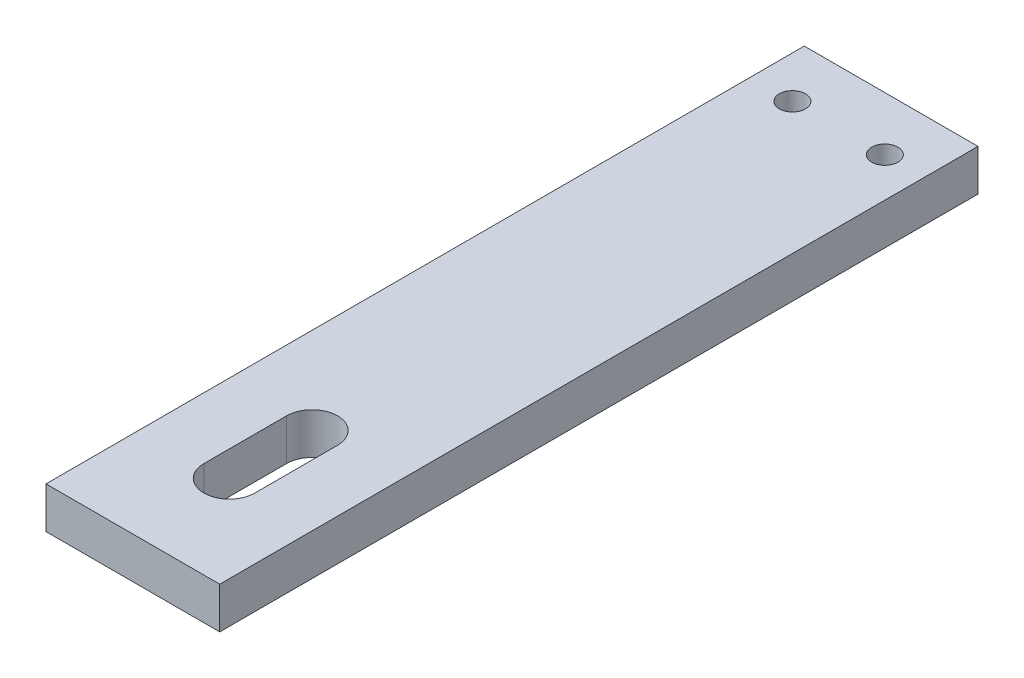
ISO-10303-21;
HEADER;
FILE_DESCRIPTION(('STEP AP214'),'2;1');
FILE_NAME('part.step','',(''),(''),'','','');
FILE_SCHEMA(('AUTOMOTIVE_DESIGN { 1 0 10303 214 1 1 1 1 }'));
ENDSEC;
DATA;
#1=APPLICATION_CONTEXT('core data for automotive mechanical design processes');
#2=APPLICATION_PROTOCOL_DEFINITION('international standard','automotive_design',2000,#1);
#3=PRODUCT_CONTEXT('',#1,'mechanical');
#4=PRODUCT('Part','Part','',(#3));
#5=PRODUCT_RELATED_PRODUCT_CATEGORY('part','',(#4));
#6=PRODUCT_DEFINITION_FORMATION('','',#4);
#7=PRODUCT_DEFINITION_CONTEXT('part definition',#1,'design');
#8=PRODUCT_DEFINITION('design','',#6,#7);
#9=PRODUCT_DEFINITION_SHAPE('','',#8);
#10=(LENGTH_UNIT() NAMED_UNIT(*) SI_UNIT(.MILLI.,.METRE.));
#11=(NAMED_UNIT(*) PLANE_ANGLE_UNIT() SI_UNIT($,.RADIAN.));
#12=(NAMED_UNIT(*) SI_UNIT($,.STERADIAN.) SOLID_ANGLE_UNIT());
#13=UNCERTAINTY_MEASURE_WITH_UNIT(LENGTH_MEASURE(1.E-05),#10,'distance_accuracy_value','');
#14=(GEOMETRIC_REPRESENTATION_CONTEXT(3) GLOBAL_UNCERTAINTY_ASSIGNED_CONTEXT((#13)) GLOBAL_UNIT_ASSIGNED_CONTEXT((#10,
#11,#12)) REPRESENTATION_CONTEXT('',''));
#15=CARTESIAN_POINT('',(0.,0.,0.));
#16=DIRECTION('',(0.,0.,1.));
#17=DIRECTION('',(1.,0.,0.));
#18=AXIS2_PLACEMENT_3D('',#15,#16,#17);
#19=CARTESIAN_POINT('',(0.,3.,0.));
#20=DIRECTION('',(0.,1.,0.));
#21=DIRECTION('',(0.,0.,1.));
#22=AXIS2_PLACEMENT_3D('',#19,#20,#21);
#23=PLANE('',#22);
#24=CARTESIAN_POINT('',(-2.86,3.,-51.1));
#25=DIRECTION('',(0.,-1.,0.));
#26=DIRECTION('',(0.,0.,-1.));
#27=AXIS2_PLACEMENT_3D('',#24,#25,#26);
#28=CIRCLE('',#27,0.95);
#29=CARTESIAN_POINT('',(-2.86,3.,-52.05));
#30=VERTEX_POINT('',#29);
#31=EDGE_CURVE('E127',#30,#30,#28,.T.);
#32=ORIENTED_EDGE('',*,*,#31,.T.);
#33=EDGE_LOOP('',(#32));
#34=FACE_BOUND('',#33,.T.);
#35=CARTESIAN_POINT('',(-9.56,3.,-51.1));
#36=DIRECTION('',(0.,-1.,0.));
#37=DIRECTION('',(0.,0.,-1.));
#38=AXIS2_PLACEMENT_3D('',#35,#36,#37);
#39=CIRCLE('',#38,0.949999999999999);
#40=CARTESIAN_POINT('',(-9.56,3.,-52.05));
#41=VERTEX_POINT('',#40);
#42=EDGE_CURVE('E231',#41,#41,#39,.T.);
#43=ORIENTED_EDGE('',*,*,#42,.T.);
#44=EDGE_LOOP('',(#43));
#45=FACE_BOUND('',#44,.T.);
#46=DIRECTION('',(0.,0.,-1.));
#47=VECTOR('',#46,1.);
#48=CARTESIAN_POINT('',(0.,3.,0.));
#49=LINE('',#48,#47);
#50=CARTESIAN_POINT('',(0.,3.,0.));
#51=VERTEX_POINT('',#50);
#52=CARTESIAN_POINT('',(0.,3.,-55.));
#53=VERTEX_POINT('',#52);
#54=EDGE_CURVE('E137',#51,#53,#49,.T.);
#55=ORIENTED_EDGE('',*,*,#54,.T.);
#56=DIRECTION('',(-1.,0.,0.));
#57=VECTOR('',#56,1.);
#58=CARTESIAN_POINT('',(0.,3.,-55.));
#59=LINE('',#58,#57);
#60=CARTESIAN_POINT('',(-12.6,3.,-55.));
#61=VERTEX_POINT('',#60);
#62=EDGE_CURVE('E140',#53,#61,#59,.T.);
#63=ORIENTED_EDGE('',*,*,#62,.T.);
#64=DIRECTION('',(0.,0.,1.));
#65=VECTOR('',#64,1.);
#66=CARTESIAN_POINT('',(-12.6,3.,0.));
#67=LINE('',#66,#65);
#68=CARTESIAN_POINT('',(-12.6,3.,0.));
#69=VERTEX_POINT('',#68);
#70=EDGE_CURVE('E143',#61,#69,#67,.T.);
#71=ORIENTED_EDGE('',*,*,#70,.T.);
#72=DIRECTION('',(1.,0.,0.));
#73=VECTOR('',#72,1.);
#74=CARTESIAN_POINT('',(0.,3.,0.));
#75=LINE('',#74,#73);
#76=EDGE_CURVE('E145',#69,#51,#75,.T.);
#77=ORIENTED_EDGE('',*,*,#76,.T.);
#78=EDGE_LOOP('',(#55,#63,#71,#77));
#79=FACE_BOUND('',#78,.T.);
#80=DIRECTION('',(0.,0.,-1.));
#81=VECTOR('',#80,1.);
#82=CARTESIAN_POINT('',(-4.45,3.,-7.));
#83=LINE('',#82,#81);
#84=CARTESIAN_POINT('',(-4.45,3.,-7.));
#85=VERTEX_POINT('',#84);
#86=CARTESIAN_POINT('',(-4.45,3.,-13.));
#87=VERTEX_POINT('',#86);
#88=EDGE_CURVE('E107',#85,#87,#83,.T.);
#89=ORIENTED_EDGE('',*,*,#88,.F.);
#90=CARTESIAN_POINT('',(-6.3,3.,-7.));
#91=DIRECTION('',(0.,1.,0.));
#92=DIRECTION('',(0.,0.,1.));
#93=AXIS2_PLACEMENT_3D('',#90,#91,#92);
#94=CIRCLE('',#93,1.85);
#95=CARTESIAN_POINT('',(-8.15,3.,-7.));
#96=VERTEX_POINT('',#95);
#97=EDGE_CURVE('E99',#96,#85,#94,.T.);
#98=ORIENTED_EDGE('',*,*,#97,.F.);
#99=DIRECTION('',(0.,0.,1.));
#100=VECTOR('',#99,1.);
#101=CARTESIAN_POINT('',(-8.15,3.,-7.));
#102=LINE('',#101,#100);
#103=CARTESIAN_POINT('',(-8.15,3.,-13.));
#104=VERTEX_POINT('',#103);
#105=EDGE_CURVE('E121',#104,#96,#102,.T.);
#106=ORIENTED_EDGE('',*,*,#105,.F.);
#107=CARTESIAN_POINT('',(-6.3,3.,-13.));
#108=DIRECTION('',(0.,1.,0.));
#109=DIRECTION('',(0.,0.,1.));
#110=AXIS2_PLACEMENT_3D('',#107,#108,#109);
#111=CIRCLE('',#110,1.85);
#112=EDGE_CURVE('E119',#87,#104,#111,.T.);
#113=ORIENTED_EDGE('',*,*,#112,.F.);
#114=EDGE_LOOP('',(#89,#98,#106,#113));
#115=FACE_BOUND('',#114,.T.);
#116=ADVANCED_FACE('F34',(#34,#45,#79,#115),#23,.T.);
#117=CARTESIAN_POINT('',(0.,0.,0.));
#118=DIRECTION('',(0.,1.,0.));
#119=DIRECTION('',(0.,0.,1.));
#120=AXIS2_PLACEMENT_3D('',#117,#118,#119);
#121=PLANE('',#120);
#122=CARTESIAN_POINT('',(-2.86,0.,-51.1));
#123=DIRECTION('',(0.,-1.,0.));
#124=DIRECTION('',(0.,0.,-1.));
#125=AXIS2_PLACEMENT_3D('',#122,#123,#124);
#126=CIRCLE('',#125,0.95);
#127=CARTESIAN_POINT('',(-2.86,0.,-52.05));
#128=VERTEX_POINT('',#127);
#129=EDGE_CURVE('E230',#128,#128,#126,.T.);
#130=ORIENTED_EDGE('',*,*,#129,.F.);
#131=EDGE_LOOP('',(#130));
#132=FACE_BOUND('',#131,.T.);
#133=CARTESIAN_POINT('',(-9.56,0.,-51.1));
#134=DIRECTION('',(0.,-1.,0.));
#135=DIRECTION('',(0.,0.,-1.));
#136=AXIS2_PLACEMENT_3D('',#133,#134,#135);
#137=CIRCLE('',#136,0.949999999999999);
#138=CARTESIAN_POINT('',(-9.56,0.,-52.05));
#139=VERTEX_POINT('',#138);
#140=EDGE_CURVE('E235',#139,#139,#137,.T.);
#141=ORIENTED_EDGE('',*,*,#140,.F.);
#142=EDGE_LOOP('',(#141));
#143=FACE_BOUND('',#142,.T.);
#144=DIRECTION('',(0.,0.,-1.));
#145=VECTOR('',#144,1.);
#146=CARTESIAN_POINT('',(0.,0.,0.));
#147=LINE('',#146,#145);
#148=CARTESIAN_POINT('',(0.,0.,0.));
#149=VERTEX_POINT('',#148);
#150=CARTESIAN_POINT('',(0.,0.,-55.));
#151=VERTEX_POINT('',#150);
#152=EDGE_CURVE('E115',#149,#151,#147,.T.);
#153=ORIENTED_EDGE('',*,*,#152,.F.);
#154=DIRECTION('',(1.,0.,0.));
#155=VECTOR('',#154,1.);
#156=CARTESIAN_POINT('',(0.,0.,0.));
#157=LINE('',#156,#155);
#158=CARTESIAN_POINT('',(-12.6,0.,0.));
#159=VERTEX_POINT('',#158);
#160=EDGE_CURVE('E141',#159,#149,#157,.T.);
#161=ORIENTED_EDGE('',*,*,#160,.F.);
#162=DIRECTION('',(0.,0.,1.));
#163=VECTOR('',#162,1.);
#164=CARTESIAN_POINT('',(-12.6,0.,0.));
#165=LINE('',#164,#163);
#166=CARTESIAN_POINT('',(-12.6,0.,-55.));
#167=VERTEX_POINT('',#166);
#168=EDGE_CURVE('E152',#167,#159,#165,.T.);
#169=ORIENTED_EDGE('',*,*,#168,.F.);
#170=DIRECTION('',(-1.,0.,0.));
#171=VECTOR('',#170,1.);
#172=CARTESIAN_POINT('',(0.,0.,-55.));
#173=LINE('',#172,#171);
#174=EDGE_CURVE('E150',#151,#167,#173,.T.);
#175=ORIENTED_EDGE('',*,*,#174,.F.);
#176=EDGE_LOOP('',(#153,#161,#169,#175));
#177=FACE_BOUND('',#176,.T.);
#178=CARTESIAN_POINT('',(-6.3,0.,-7.));
#179=DIRECTION('',(0.,1.,0.));
#180=DIRECTION('',(0.,0.,1.));
#181=AXIS2_PLACEMENT_3D('',#178,#179,#180);
#182=CIRCLE('',#181,1.85);
#183=CARTESIAN_POINT('',(-8.15,0.,-7.));
#184=VERTEX_POINT('',#183);
#185=CARTESIAN_POINT('',(-4.45,0.,-7.));
#186=VERTEX_POINT('',#185);
#187=EDGE_CURVE('E57',#184,#186,#182,.T.);
#188=ORIENTED_EDGE('',*,*,#187,.T.);
#189=DIRECTION('',(0.,0.,-1.));
#190=VECTOR('',#189,1.);
#191=CARTESIAN_POINT('',(-4.45,0.,-7.));
#192=LINE('',#191,#190);
#193=CARTESIAN_POINT('',(-4.45,0.,-13.));
#194=VERTEX_POINT('',#193);
#195=EDGE_CURVE('E114',#186,#194,#192,.T.);
#196=ORIENTED_EDGE('',*,*,#195,.T.);
#197=CARTESIAN_POINT('',(-6.3,0.,-13.));
#198=DIRECTION('',(0.,1.,0.));
#199=DIRECTION('',(0.,0.,1.));
#200=AXIS2_PLACEMENT_3D('',#197,#198,#199);
#201=CIRCLE('',#200,1.85);
#202=CARTESIAN_POINT('',(-8.15,0.,-13.));
#203=VERTEX_POINT('',#202);
#204=EDGE_CURVE('E129',#194,#203,#201,.T.);
#205=ORIENTED_EDGE('',*,*,#204,.T.);
#206=DIRECTION('',(0.,0.,1.));
#207=VECTOR('',#206,1.);
#208=CARTESIAN_POINT('',(-8.15,0.,-7.));
#209=LINE('',#208,#207);
#210=EDGE_CURVE('E108',#203,#184,#209,.T.);
#211=ORIENTED_EDGE('',*,*,#210,.T.);
#212=EDGE_LOOP('',(#188,#196,#205,#211));
#213=FACE_BOUND('',#212,.T.);
#214=ADVANCED_FACE('F170',(#132,#143,#177,#213),#121,.F.);
#215=CARTESIAN_POINT('',(0.,3.,0.));
#216=DIRECTION('',(-1.,0.,0.));
#217=DIRECTION('',(0.,0.,1.));
#218=AXIS2_PLACEMENT_3D('',#215,#216,#217);
#219=PLANE('',#218);
#220=ORIENTED_EDGE('',*,*,#152,.T.);
#221=DIRECTION('',(0.,-1.,0.));
#222=VECTOR('',#221,1.);
#223=CARTESIAN_POINT('',(0.,3.,-55.));
#224=LINE('',#223,#222);
#225=EDGE_CURVE('E11',#53,#151,#224,.T.);
#226=ORIENTED_EDGE('',*,*,#225,.F.);
#227=ORIENTED_EDGE('',*,*,#54,.F.);
#228=DIRECTION('',(0.,-1.,0.));
#229=VECTOR('',#228,1.);
#230=CARTESIAN_POINT('',(0.,3.,0.));
#231=LINE('',#230,#229);
#232=EDGE_CURVE('E147',#51,#149,#231,.T.);
#233=ORIENTED_EDGE('',*,*,#232,.T.);
#234=EDGE_LOOP('',(#220,#226,#227,#233));
#235=FACE_BOUND('',#234,.T.);
#236=ADVANCED_FACE('F36',(#235),#219,.F.);
#237=CARTESIAN_POINT('',(0.,3.,-55.));
#238=DIRECTION('',(0.,0.,1.));
#239=DIRECTION('',(1.,0.,0.));
#240=AXIS2_PLACEMENT_3D('',#237,#238,#239);
#241=PLANE('',#240);
#242=ORIENTED_EDGE('',*,*,#174,.T.);
#243=DIRECTION('',(0.,-1.,0.));
#244=VECTOR('',#243,1.);
#245=CARTESIAN_POINT('',(-12.6,3.,-55.));
#246=LINE('',#245,#244);
#247=EDGE_CURVE('E42',#61,#167,#246,.T.);
#248=ORIENTED_EDGE('',*,*,#247,.F.);
#249=ORIENTED_EDGE('',*,*,#62,.F.);
#250=ORIENTED_EDGE('',*,*,#225,.T.);
#251=EDGE_LOOP('',(#242,#248,#249,#250));
#252=FACE_BOUND('',#251,.T.);
#253=ADVANCED_FACE('F180',(#252),#241,.F.);
#254=CARTESIAN_POINT('',(-12.6,3.,0.));
#255=DIRECTION('',(1.,0.,0.));
#256=DIRECTION('',(0.,0.,-1.));
#257=AXIS2_PLACEMENT_3D('',#254,#255,#256);
#258=PLANE('',#257);
#259=ORIENTED_EDGE('',*,*,#168,.T.);
#260=DIRECTION('',(0.,-1.,0.));
#261=VECTOR('',#260,1.);
#262=CARTESIAN_POINT('',(-12.6,3.,0.));
#263=LINE('',#262,#261);
#264=EDGE_CURVE('E157',#69,#159,#263,.T.);
#265=ORIENTED_EDGE('',*,*,#264,.F.);
#266=ORIENTED_EDGE('',*,*,#70,.F.);
#267=ORIENTED_EDGE('',*,*,#247,.T.);
#268=EDGE_LOOP('',(#259,#265,#266,#267));
#269=FACE_BOUND('',#268,.T.);
#270=ADVANCED_FACE('F164',(#269),#258,.F.);
#271=CARTESIAN_POINT('',(0.,3.,0.));
#272=DIRECTION('',(0.,0.,-1.));
#273=DIRECTION('',(-1.,0.,0.));
#274=AXIS2_PLACEMENT_3D('',#271,#272,#273);
#275=PLANE('',#274);
#276=ORIENTED_EDGE('',*,*,#160,.T.);
#277=ORIENTED_EDGE('',*,*,#232,.F.);
#278=ORIENTED_EDGE('',*,*,#76,.F.);
#279=ORIENTED_EDGE('',*,*,#264,.T.);
#280=EDGE_LOOP('',(#276,#277,#278,#279));
#281=FACE_BOUND('',#280,.T.);
#282=ADVANCED_FACE('F174',(#281),#275,.F.);
#283=CARTESIAN_POINT('',(-6.3,3.,-7.));
#284=DIRECTION('',(0.,-1.,0.));
#285=DIRECTION('',(0.,0.,-1.));
#286=AXIS2_PLACEMENT_3D('',#283,#284,#285);
#287=CYLINDRICAL_SURFACE('',#286,1.85);
#288=ORIENTED_EDGE('',*,*,#187,.F.);
#289=DIRECTION('',(0.,-1.,0.));
#290=VECTOR('',#289,1.);
#291=CARTESIAN_POINT('',(-8.15,3.,-7.));
#292=LINE('',#291,#290);
#293=EDGE_CURVE('E103',#96,#184,#292,.T.);
#294=ORIENTED_EDGE('',*,*,#293,.F.);
#295=ORIENTED_EDGE('',*,*,#97,.T.);
#296=DIRECTION('',(0.,-1.,0.));
#297=VECTOR('',#296,1.);
#298=CARTESIAN_POINT('',(-4.45,3.,-7.));
#299=LINE('',#298,#297);
#300=EDGE_CURVE('E102',#85,#186,#299,.T.);
#301=ORIENTED_EDGE('',*,*,#300,.T.);
#302=EDGE_LOOP('',(#288,#294,#295,#301));
#303=FACE_BOUND('',#302,.T.);
#304=ADVANCED_FACE('F101',(#303),#287,.F.);
#305=CARTESIAN_POINT('',(-4.45,3.,-7.));
#306=DIRECTION('',(-1.,0.,0.));
#307=DIRECTION('',(0.,0.,1.));
#308=AXIS2_PLACEMENT_3D('',#305,#306,#307);
#309=PLANE('',#308);
#310=ORIENTED_EDGE('',*,*,#195,.F.);
#311=ORIENTED_EDGE('',*,*,#300,.F.);
#312=ORIENTED_EDGE('',*,*,#88,.T.);
#313=DIRECTION('',(0.,-1.,0.));
#314=VECTOR('',#313,1.);
#315=CARTESIAN_POINT('',(-4.45,3.,-13.));
#316=LINE('',#315,#314);
#317=EDGE_CURVE('E116',#87,#194,#316,.T.);
#318=ORIENTED_EDGE('',*,*,#317,.T.);
#319=EDGE_LOOP('',(#310,#311,#312,#318));
#320=FACE_BOUND('',#319,.T.);
#321=ADVANCED_FACE('F111',(#320),#309,.T.);
#322=CARTESIAN_POINT('',(-6.3,3.,-13.));
#323=DIRECTION('',(0.,-1.,0.));
#324=DIRECTION('',(0.,0.,-1.));
#325=AXIS2_PLACEMENT_3D('',#322,#323,#324);
#326=CYLINDRICAL_SURFACE('',#325,1.85);
#327=ORIENTED_EDGE('',*,*,#204,.F.);
#328=ORIENTED_EDGE('',*,*,#317,.F.);
#329=ORIENTED_EDGE('',*,*,#112,.T.);
#330=DIRECTION('',(0.,-1.,0.));
#331=VECTOR('',#330,1.);
#332=CARTESIAN_POINT('',(-8.15,3.,-13.));
#333=LINE('',#332,#331);
#334=EDGE_CURVE('E49',#104,#203,#333,.T.);
#335=ORIENTED_EDGE('',*,*,#334,.T.);
#336=EDGE_LOOP('',(#327,#328,#329,#335));
#337=FACE_BOUND('',#336,.T.);
#338=ADVANCED_FACE('F207',(#337),#326,.F.);
#339=CARTESIAN_POINT('',(-8.15,3.,-7.));
#340=DIRECTION('',(1.,0.,0.));
#341=DIRECTION('',(0.,0.,-1.));
#342=AXIS2_PLACEMENT_3D('',#339,#340,#341);
#343=PLANE('',#342);
#344=ORIENTED_EDGE('',*,*,#210,.F.);
#345=ORIENTED_EDGE('',*,*,#334,.F.);
#346=ORIENTED_EDGE('',*,*,#105,.T.);
#347=ORIENTED_EDGE('',*,*,#293,.T.);
#348=EDGE_LOOP('',(#344,#345,#346,#347));
#349=FACE_BOUND('',#348,.T.);
#350=ADVANCED_FACE('F211',(#349),#343,.T.);
#351=CARTESIAN_POINT('',(-9.56,3.,-51.1));
#352=DIRECTION('',(0.,-1.,0.));
#353=DIRECTION('',(0.,0.,-1.));
#354=AXIS2_PLACEMENT_3D('',#351,#352,#353);
#355=CYLINDRICAL_SURFACE('',#354,0.949999999999999);
#356=ORIENTED_EDGE('',*,*,#42,.F.);
#357=EDGE_LOOP('',(#356));
#358=FACE_BOUND('',#357,.T.);
#359=ORIENTED_EDGE('',*,*,#140,.T.);
#360=EDGE_LOOP('',(#359));
#361=FACE_BOUND('',#360,.T.);
#362=ADVANCED_FACE('F217',(#358,#361),#355,.F.);
#363=CARTESIAN_POINT('',(-2.86,3.,-51.1));
#364=DIRECTION('',(0.,-1.,0.));
#365=DIRECTION('',(0.,0.,-1.));
#366=AXIS2_PLACEMENT_3D('',#363,#364,#365);
#367=CYLINDRICAL_SURFACE('',#366,0.95);
#368=ORIENTED_EDGE('',*,*,#31,.F.);
#369=EDGE_LOOP('',(#368));
#370=FACE_BOUND('',#369,.T.);
#371=ORIENTED_EDGE('',*,*,#129,.T.);
#372=EDGE_LOOP('',(#371));
#373=FACE_BOUND('',#372,.T.);
#374=ADVANCED_FACE('F220',(#370,#373),#367,.F.);
#375=CLOSED_SHELL('',(#116,#214,#236,#253,#270,#282,#304,#321,#338,#350,#362,#374));
#376=MANIFOLD_SOLID_BREP('B2',#375);
#377=ADVANCED_BREP_SHAPE_REPRESENTATION('',(#18,#376),#14);
#378=SHAPE_DEFINITION_REPRESENTATION(#9,#377);
ENDSEC;
END-ISO-10303-21;
